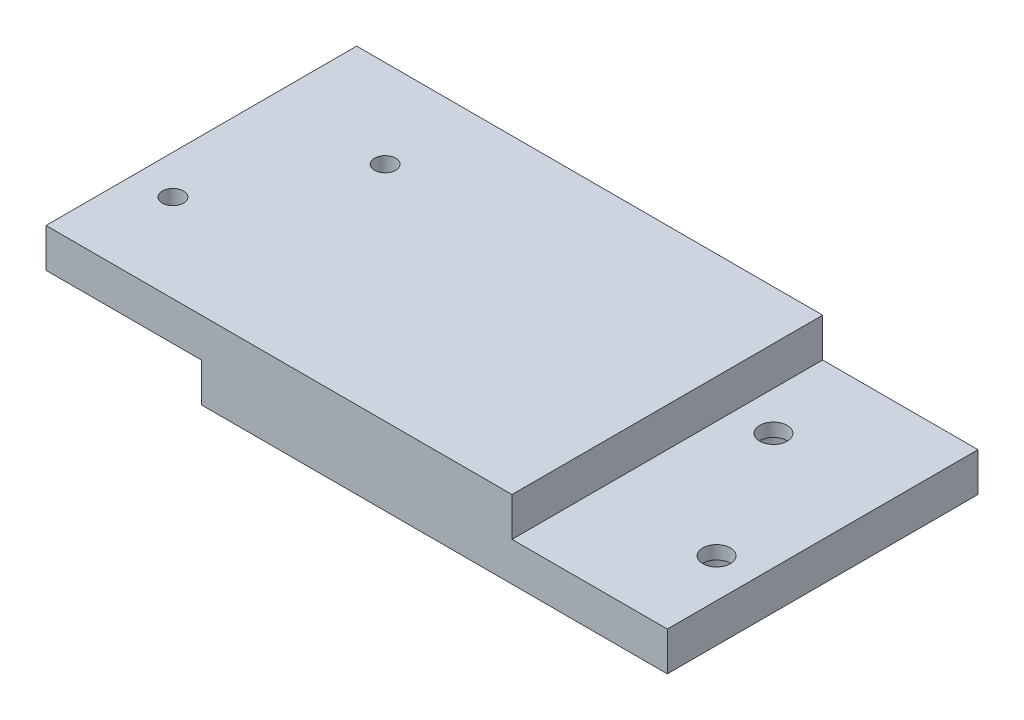
ISO-10303-21;
HEADER;
FILE_DESCRIPTION(('STEP AP214'),'2;1');
FILE_NAME('part.step','',(''),(''),'','','');
FILE_SCHEMA(('AUTOMOTIVE_DESIGN { 1 0 10303 214 1 1 1 1 }'));
ENDSEC;
DATA;
#1=APPLICATION_CONTEXT('core data for automotive mechanical design processes');
#2=APPLICATION_PROTOCOL_DEFINITION('international standard','automotive_design',2000,#1);
#3=PRODUCT_CONTEXT('',#1,'mechanical');
#4=PRODUCT('Part','Part','',(#3));
#5=PRODUCT_RELATED_PRODUCT_CATEGORY('part','',(#4));
#6=PRODUCT_DEFINITION_FORMATION('','',#4);
#7=PRODUCT_DEFINITION_CONTEXT('part definition',#1,'design');
#8=PRODUCT_DEFINITION('design','',#6,#7);
#9=PRODUCT_DEFINITION_SHAPE('','',#8);
#10=(LENGTH_UNIT() NAMED_UNIT(*) SI_UNIT(.MILLI.,.METRE.));
#11=(NAMED_UNIT(*) PLANE_ANGLE_UNIT() SI_UNIT($,.RADIAN.));
#12=(NAMED_UNIT(*) SI_UNIT($,.STERADIAN.) SOLID_ANGLE_UNIT());
#13=UNCERTAINTY_MEASURE_WITH_UNIT(LENGTH_MEASURE(1.E-05),#10,'distance_accuracy_value','');
#14=(GEOMETRIC_REPRESENTATION_CONTEXT(3) GLOBAL_UNCERTAINTY_ASSIGNED_CONTEXT((#13)) GLOBAL_UNIT_ASSIGNED_CONTEXT((#10,
#11,#12)) REPRESENTATION_CONTEXT('',''));
#15=CARTESIAN_POINT('',(0.,0.,0.));
#16=DIRECTION('',(0.,0.,1.));
#17=DIRECTION('',(1.,0.,0.));
#18=AXIS2_PLACEMENT_3D('',#15,#16,#17);
#19=CARTESIAN_POINT('',(76.2,0.,50.8));
#20=DIRECTION('',(1.,0.,0.));
#21=DIRECTION('',(0.,0.,-1.));
#22=AXIS2_PLACEMENT_3D('',#19,#20,#21);
#23=PLANE('',#22);
#24=DIRECTION('',(0.,-1.,0.));
#25=VECTOR('',#24,1.);
#26=CARTESIAN_POINT('',(76.2,0.,0.));
#27=LINE('',#26,#25);
#28=CARTESIAN_POINT('',(76.2,12.7,0.));
#29=VERTEX_POINT('',#28);
#30=CARTESIAN_POINT('',(76.2,6.35,0.));
#31=VERTEX_POINT('',#30);
#32=EDGE_CURVE('E141',#29,#31,#27,.T.);
#33=ORIENTED_EDGE('',*,*,#32,.F.);
#34=DIRECTION('',(0.,0.,-1.));
#35=VECTOR('',#34,1.);
#36=CARTESIAN_POINT('',(76.2,12.7,50.8));
#37=LINE('',#36,#35);
#38=CARTESIAN_POINT('',(76.2,12.7,50.8));
#39=VERTEX_POINT('',#38);
#40=EDGE_CURVE('E11',#39,#29,#37,.T.);
#41=ORIENTED_EDGE('',*,*,#40,.F.);
#42=DIRECTION('',(0.,-1.,0.));
#43=VECTOR('',#42,1.);
#44=CARTESIAN_POINT('',(76.2,0.,50.8));
#45=LINE('',#44,#43);
#46=CARTESIAN_POINT('',(76.2,6.35,50.8));
#47=VERTEX_POINT('',#46);
#48=EDGE_CURVE('E169',#39,#47,#45,.T.);
#49=ORIENTED_EDGE('',*,*,#48,.T.);
#50=DIRECTION('',(0.,0.,-1.));
#51=VECTOR('',#50,1.);
#52=CARTESIAN_POINT('',(76.2,6.35,50.8));
#53=LINE('',#52,#51);
#54=EDGE_CURVE('E96',#47,#31,#53,.T.);
#55=ORIENTED_EDGE('',*,*,#54,.T.);
#56=EDGE_LOOP('',(#33,#41,#49,#55));
#57=FACE_BOUND('',#56,.T.);
#58=ADVANCED_FACE('F42',(#57),#23,.T.);
#59=CARTESIAN_POINT('',(0.,12.7,50.8));
#60=DIRECTION('',(0.,1.,0.));
#61=DIRECTION('',(-1.,0.,0.));
#62=AXIS2_PLACEMENT_3D('',#59,#60,#61);
#63=PLANE('',#62);
#64=CARTESIAN_POINT('',(6.35,12.7,36.3985226280624));
#65=DIRECTION('',(0.,1.,0.));
#66=DIRECTION('',(0.,0.,1.));
#67=AXIS2_PLACEMENT_3D('',#64,#65,#66);
#68=CIRCLE('',#67,1.72719999999999);
#69=CARTESIAN_POINT('',(6.35,12.7,38.1257226280624));
#70=VERTEX_POINT('',#69);
#71=EDGE_CURVE('E191',#70,#70,#68,.T.);
#72=ORIENTED_EDGE('',*,*,#71,.F.);
#73=EDGE_LOOP('',(#72));
#74=FACE_BOUND('',#73,.T.);
#75=CARTESIAN_POINT('',(19.05,12.7,14.4014773719376));
#76=DIRECTION('',(0.,1.,0.));
#77=DIRECTION('',(0.,0.,1.));
#78=AXIS2_PLACEMENT_3D('',#75,#76,#77);
#79=CIRCLE('',#78,1.72719999999999);
#80=CARTESIAN_POINT('',(19.05,12.7,16.1286773719376));
#81=VERTEX_POINT('',#80);
#82=EDGE_CURVE('E187',#81,#81,#79,.T.);
#83=ORIENTED_EDGE('',*,*,#82,.F.);
#84=EDGE_LOOP('',(#83));
#85=FACE_BOUND('',#84,.T.);
#86=DIRECTION('',(1.,0.,0.));
#87=VECTOR('',#86,1.);
#88=CARTESIAN_POINT('',(0.,12.7,0.));
#89=LINE('',#88,#87);
#90=CARTESIAN_POINT('',(0.,12.7,0.));
#91=VERTEX_POINT('',#90);
#92=EDGE_CURVE('E145',#91,#29,#89,.T.);
#93=ORIENTED_EDGE('',*,*,#92,.F.);
#94=DIRECTION('',(0.,0.,-1.));
#95=VECTOR('',#94,1.);
#96=CARTESIAN_POINT('',(0.,12.7,50.8));
#97=LINE('',#96,#95);
#98=CARTESIAN_POINT('',(0.,12.7,50.8));
#99=VERTEX_POINT('',#98);
#100=EDGE_CURVE('E52',#99,#91,#97,.T.);
#101=ORIENTED_EDGE('',*,*,#100,.F.);
#102=DIRECTION('',(1.,0.,0.));
#103=VECTOR('',#102,1.);
#104=CARTESIAN_POINT('',(0.,12.7,50.8));
#105=LINE('',#104,#103);
#106=EDGE_CURVE('E220',#99,#39,#105,.T.);
#107=ORIENTED_EDGE('',*,*,#106,.T.);
#108=ORIENTED_EDGE('',*,*,#40,.T.);
#109=EDGE_LOOP('',(#93,#101,#107,#108));
#110=FACE_BOUND('',#109,.T.);
#111=ADVANCED_FACE('F246',(#74,#85,#110),#63,.T.);
#112=CARTESIAN_POINT('',(0.,0.,50.8));
#113=DIRECTION('',(-1.,0.,0.));
#114=DIRECTION('',(0.,0.,1.));
#115=AXIS2_PLACEMENT_3D('',#112,#113,#114);
#116=PLANE('',#115);
#117=DIRECTION('',(0.,1.,0.));
#118=VECTOR('',#117,1.);
#119=CARTESIAN_POINT('',(0.,0.,0.));
#120=LINE('',#119,#118);
#121=CARTESIAN_POINT('',(0.,6.35,0.));
#122=VERTEX_POINT('',#121);
#123=EDGE_CURVE('E150',#122,#91,#120,.T.);
#124=ORIENTED_EDGE('',*,*,#123,.F.);
#125=DIRECTION('',(0.,0.,-1.));
#126=VECTOR('',#125,1.);
#127=CARTESIAN_POINT('',(0.,6.35,50.8));
#128=LINE('',#127,#126);
#129=CARTESIAN_POINT('',(0.,6.35,50.8));
#130=VERTEX_POINT('',#129);
#131=EDGE_CURVE('E179',#130,#122,#128,.T.);
#132=ORIENTED_EDGE('',*,*,#131,.F.);
#133=DIRECTION('',(0.,1.,0.));
#134=VECTOR('',#133,1.);
#135=CARTESIAN_POINT('',(0.,0.,50.8));
#136=LINE('',#135,#134);
#137=EDGE_CURVE('E224',#130,#99,#136,.T.);
#138=ORIENTED_EDGE('',*,*,#137,.T.);
#139=ORIENTED_EDGE('',*,*,#100,.T.);
#140=EDGE_LOOP('',(#124,#132,#138,#139));
#141=FACE_BOUND('',#140,.T.);
#142=ADVANCED_FACE('F249',(#141),#116,.T.);
#143=CARTESIAN_POINT('',(0.,6.35,50.8));
#144=DIRECTION('',(0.,1.,0.));
#145=DIRECTION('',(0.,0.,1.));
#146=AXIS2_PLACEMENT_3D('',#143,#144,#145);
#147=PLANE('',#146);
#148=CARTESIAN_POINT('',(6.35,6.35,36.3985226280624));
#149=DIRECTION('',(0.,1.,0.));
#150=DIRECTION('',(0.,0.,1.));
#151=AXIS2_PLACEMENT_3D('',#148,#149,#150);
#152=CIRCLE('',#151,1.72719999999999);
#153=CARTESIAN_POINT('',(6.35,6.35,38.1257226280624));
#154=VERTEX_POINT('',#153);
#155=EDGE_CURVE('E188',#154,#154,#152,.T.);
#156=ORIENTED_EDGE('',*,*,#155,.T.);
#157=EDGE_LOOP('',(#156));
#158=FACE_BOUND('',#157,.T.);
#159=CARTESIAN_POINT('',(19.05,6.35,14.4014773719376));
#160=DIRECTION('',(0.,1.,0.));
#161=DIRECTION('',(0.,0.,1.));
#162=AXIS2_PLACEMENT_3D('',#159,#160,#161);
#163=CIRCLE('',#162,1.72719999999999);
#164=CARTESIAN_POINT('',(19.05,6.35,16.1286773719376));
#165=VERTEX_POINT('',#164);
#166=EDGE_CURVE('E146',#165,#165,#163,.T.);
#167=ORIENTED_EDGE('',*,*,#166,.T.);
#168=EDGE_LOOP('',(#167));
#169=FACE_BOUND('',#168,.T.);
#170=DIRECTION('',(1.,0.,0.));
#171=VECTOR('',#170,1.);
#172=CARTESIAN_POINT('',(0.,6.35,0.));
#173=LINE('',#172,#171);
#174=CARTESIAN_POINT('',(25.4,6.35,0.));
#175=VERTEX_POINT('',#174);
#176=EDGE_CURVE('E154',#122,#175,#173,.T.);
#177=ORIENTED_EDGE('',*,*,#176,.T.);
#178=DIRECTION('',(0.,0.,-1.));
#179=VECTOR('',#178,1.);
#180=CARTESIAN_POINT('',(25.4,6.35,50.8));
#181=LINE('',#180,#179);
#182=CARTESIAN_POINT('',(25.4,6.35,50.8));
#183=VERTEX_POINT('',#182);
#184=EDGE_CURVE('E176',#183,#175,#181,.T.);
#185=ORIENTED_EDGE('',*,*,#184,.F.);
#186=DIRECTION('',(1.,0.,0.));
#187=VECTOR('',#186,1.);
#188=CARTESIAN_POINT('',(0.,6.35,50.8));
#189=LINE('',#188,#187);
#190=EDGE_CURVE('E228',#130,#183,#189,.T.);
#191=ORIENTED_EDGE('',*,*,#190,.F.);
#192=ORIENTED_EDGE('',*,*,#131,.T.);
#193=EDGE_LOOP('',(#177,#185,#191,#192));
#194=FACE_BOUND('',#193,.T.);
#195=ADVANCED_FACE('F252',(#158,#169,#194),#147,.F.);
#196=CARTESIAN_POINT('',(25.4,0.,50.8));
#197=DIRECTION('',(-1.,0.,0.));
#198=DIRECTION('',(0.,0.,1.));
#199=AXIS2_PLACEMENT_3D('',#196,#197,#198);
#200=PLANE('',#199);
#201=DIRECTION('',(0.,1.,0.));
#202=VECTOR('',#201,1.);
#203=CARTESIAN_POINT('',(25.4,0.,0.));
#204=LINE('',#203,#202);
#205=CARTESIAN_POINT('',(25.4,0.,0.));
#206=VERTEX_POINT('',#205);
#207=EDGE_CURVE('E158',#206,#175,#204,.T.);
#208=ORIENTED_EDGE('',*,*,#207,.F.);
#209=DIRECTION('',(0.,0.,-1.));
#210=VECTOR('',#209,1.);
#211=CARTESIAN_POINT('',(25.4,0.,50.8));
#212=LINE('',#211,#210);
#213=CARTESIAN_POINT('',(25.4,0.,50.8));
#214=VERTEX_POINT('',#213);
#215=EDGE_CURVE('E130',#214,#206,#212,.T.);
#216=ORIENTED_EDGE('',*,*,#215,.F.);
#217=DIRECTION('',(0.,1.,0.));
#218=VECTOR('',#217,1.);
#219=CARTESIAN_POINT('',(25.4,0.,50.8));
#220=LINE('',#219,#218);
#221=EDGE_CURVE('E121',#214,#183,#220,.T.);
#222=ORIENTED_EDGE('',*,*,#221,.T.);
#223=ORIENTED_EDGE('',*,*,#184,.T.);
#224=EDGE_LOOP('',(#208,#216,#222,#223));
#225=FACE_BOUND('',#224,.T.);
#226=ADVANCED_FACE('F234',(#225),#200,.T.);
#227=CARTESIAN_POINT('',(0.,0.,50.8));
#228=DIRECTION('',(0.,1.,0.));
#229=DIRECTION('',(0.,0.,1.));
#230=AXIS2_PLACEMENT_3D('',#227,#228,#229);
#231=PLANE('',#230);
#232=CARTESIAN_POINT('',(95.25,0.,36.3985226280624));
#233=DIRECTION('',(0.,-1.,0.));
#234=DIRECTION('',(0.,0.,-1.));
#235=AXIS2_PLACEMENT_3D('',#232,#233,#234);
#236=CIRCLE('',#235,3.96875000000001);
#237=CARTESIAN_POINT('',(95.25,0.,32.4297726280624));
#238=VERTEX_POINT('',#237);
#239=EDGE_CURVE('E304',#238,#238,#236,.T.);
#240=ORIENTED_EDGE('',*,*,#239,.F.);
#241=EDGE_LOOP('',(#240));
#242=FACE_BOUND('',#241,.T.);
#243=CARTESIAN_POINT('',(82.55,0.,14.4014773719376));
#244=DIRECTION('',(0.,-1.,0.));
#245=DIRECTION('',(0.,0.,-1.));
#246=AXIS2_PLACEMENT_3D('',#243,#244,#245);
#247=CIRCLE('',#246,3.96875000000001);
#248=CARTESIAN_POINT('',(82.55,0.,10.4327273719376));
#249=VERTEX_POINT('',#248);
#250=EDGE_CURVE('E211',#249,#249,#247,.T.);
#251=ORIENTED_EDGE('',*,*,#250,.F.);
#252=EDGE_LOOP('',(#251));
#253=FACE_BOUND('',#252,.T.);
#254=DIRECTION('',(1.,0.,0.));
#255=VECTOR('',#254,1.);
#256=CARTESIAN_POINT('',(0.,0.,0.));
#257=LINE('',#256,#255);
#258=CARTESIAN_POINT('',(101.6,0.,0.));
#259=VERTEX_POINT('',#258);
#260=EDGE_CURVE('E128',#206,#259,#257,.T.);
#261=ORIENTED_EDGE('',*,*,#260,.T.);
#262=DIRECTION('',(0.,0.,-1.));
#263=VECTOR('',#262,1.);
#264=CARTESIAN_POINT('',(101.6,0.,50.8));
#265=LINE('',#264,#263);
#266=CARTESIAN_POINT('',(101.6,0.,50.8));
#267=VERTEX_POINT('',#266);
#268=EDGE_CURVE('E125',#267,#259,#265,.T.);
#269=ORIENTED_EDGE('',*,*,#268,.F.);
#270=DIRECTION('',(1.,0.,0.));
#271=VECTOR('',#270,1.);
#272=CARTESIAN_POINT('',(0.,0.,50.8));
#273=LINE('',#272,#271);
#274=EDGE_CURVE('E115',#214,#267,#273,.T.);
#275=ORIENTED_EDGE('',*,*,#274,.F.);
#276=ORIENTED_EDGE('',*,*,#215,.T.);
#277=EDGE_LOOP('',(#261,#269,#275,#276));
#278=FACE_BOUND('',#277,.T.);
#279=ADVANCED_FACE('F126',(#242,#253,#278),#231,.F.);
#280=CARTESIAN_POINT('',(101.6,0.,50.8));
#281=DIRECTION('',(-1.,0.,0.));
#282=DIRECTION('',(0.,0.,1.));
#283=AXIS2_PLACEMENT_3D('',#280,#281,#282);
#284=PLANE('',#283);
#285=DIRECTION('',(0.,1.,0.));
#286=VECTOR('',#285,1.);
#287=CARTESIAN_POINT('',(101.6,0.,0.));
#288=LINE('',#287,#286);
#289=CARTESIAN_POINT('',(101.6,6.35,0.));
#290=VERTEX_POINT('',#289);
#291=EDGE_CURVE('E89',#259,#290,#288,.T.);
#292=ORIENTED_EDGE('',*,*,#291,.T.);
#293=DIRECTION('',(0.,0.,-1.));
#294=VECTOR('',#293,1.);
#295=CARTESIAN_POINT('',(101.6,6.35,50.8));
#296=LINE('',#295,#294);
#297=CARTESIAN_POINT('',(101.6,6.35,50.8));
#298=VERTEX_POINT('',#297);
#299=EDGE_CURVE('E131',#298,#290,#296,.T.);
#300=ORIENTED_EDGE('',*,*,#299,.F.);
#301=DIRECTION('',(0.,1.,0.));
#302=VECTOR('',#301,1.);
#303=CARTESIAN_POINT('',(101.6,0.,50.8));
#304=LINE('',#303,#302);
#305=EDGE_CURVE('E119',#267,#298,#304,.T.);
#306=ORIENTED_EDGE('',*,*,#305,.F.);
#307=ORIENTED_EDGE('',*,*,#268,.T.);
#308=EDGE_LOOP('',(#292,#300,#306,#307));
#309=FACE_BOUND('',#308,.T.);
#310=ADVANCED_FACE('F133',(#309),#284,.F.);
#311=CARTESIAN_POINT('',(0.,6.34999999999997,50.8));
#312=DIRECTION('',(0.,-1.,0.));
#313=DIRECTION('',(1.,0.,0.));
#314=AXIS2_PLACEMENT_3D('',#311,#312,#313);
#315=PLANE('',#314);
#316=CARTESIAN_POINT('',(95.25,6.35,36.3985226280624));
#317=DIRECTION('',(0.,-1.,0.));
#318=DIRECTION('',(1.,0.,0.));
#319=AXIS2_PLACEMENT_3D('',#316,#317,#318);
#320=CIRCLE('',#319,2.2479);
#321=CARTESIAN_POINT('',(97.4979,6.35,36.3985226280624));
#322=VERTEX_POINT('',#321);
#323=EDGE_CURVE('E45',#322,#322,#320,.T.);
#324=ORIENTED_EDGE('',*,*,#323,.T.);
#325=EDGE_LOOP('',(#324));
#326=FACE_BOUND('',#325,.T.);
#327=CARTESIAN_POINT('',(82.55,6.35,14.4014773719376));
#328=DIRECTION('',(0.,-1.,0.));
#329=DIRECTION('',(1.,0.,0.));
#330=AXIS2_PLACEMENT_3D('',#327,#328,#329);
#331=CIRCLE('',#330,2.2479);
#332=CARTESIAN_POINT('',(84.7979,6.35,14.4014773719376));
#333=VERTEX_POINT('',#332);
#334=EDGE_CURVE('E192',#333,#333,#331,.T.);
#335=ORIENTED_EDGE('',*,*,#334,.T.);
#336=EDGE_LOOP('',(#335));
#337=FACE_BOUND('',#336,.T.);
#338=DIRECTION('',(-1.,0.,0.));
#339=VECTOR('',#338,1.);
#340=CARTESIAN_POINT('',(0.,6.34999999999997,0.));
#341=LINE('',#340,#339);
#342=EDGE_CURVE('E166',#290,#31,#341,.T.);
#343=ORIENTED_EDGE('',*,*,#342,.T.);
#344=ORIENTED_EDGE('',*,*,#54,.F.);
#345=DIRECTION('',(-1.,0.,0.));
#346=VECTOR('',#345,1.);
#347=CARTESIAN_POINT('',(0.,6.34999999999997,50.8));
#348=LINE('',#347,#346);
#349=EDGE_CURVE('E61',#298,#47,#348,.T.);
#350=ORIENTED_EDGE('',*,*,#349,.F.);
#351=ORIENTED_EDGE('',*,*,#299,.T.);
#352=EDGE_LOOP('',(#343,#344,#350,#351));
#353=FACE_BOUND('',#352,.T.);
#354=ADVANCED_FACE('F241',(#326,#337,#353),#315,.F.);
#355=CARTESIAN_POINT('',(0.,0.,50.8));
#356=DIRECTION('',(0.,0.,1.));
#357=DIRECTION('',(1.,0.,0.));
#358=AXIS2_PLACEMENT_3D('',#355,#356,#357);
#359=PLANE('',#358);
#360=ORIENTED_EDGE('',*,*,#48,.F.);
#361=ORIENTED_EDGE('',*,*,#106,.F.);
#362=ORIENTED_EDGE('',*,*,#137,.F.);
#363=ORIENTED_EDGE('',*,*,#190,.T.);
#364=ORIENTED_EDGE('',*,*,#221,.F.);
#365=ORIENTED_EDGE('',*,*,#274,.T.);
#366=ORIENTED_EDGE('',*,*,#305,.T.);
#367=ORIENTED_EDGE('',*,*,#349,.T.);
#368=EDGE_LOOP('',(#360,#361,#362,#363,#364,#365,#366,#367));
#369=FACE_BOUND('',#368,.T.);
#370=ADVANCED_FACE('F117',(#369),#359,.T.);
#371=CARTESIAN_POINT('',(0.,0.,0.));
#372=DIRECTION('',(0.,0.,1.));
#373=DIRECTION('',(1.,0.,0.));
#374=AXIS2_PLACEMENT_3D('',#371,#372,#373);
#375=PLANE('',#374);
#376=ORIENTED_EDGE('',*,*,#32,.T.);
#377=ORIENTED_EDGE('',*,*,#342,.F.);
#378=ORIENTED_EDGE('',*,*,#291,.F.);
#379=ORIENTED_EDGE('',*,*,#260,.F.);
#380=ORIENTED_EDGE('',*,*,#207,.T.);
#381=ORIENTED_EDGE('',*,*,#176,.F.);
#382=ORIENTED_EDGE('',*,*,#123,.T.);
#383=ORIENTED_EDGE('',*,*,#92,.T.);
#384=EDGE_LOOP('',(#376,#377,#378,#379,#380,#381,#382,#383));
#385=FACE_BOUND('',#384,.T.);
#386=ADVANCED_FACE('F237',(#385),#375,.F.);
#387=CARTESIAN_POINT('',(19.05,12.7,14.4014773719376));
#388=DIRECTION('',(0.,1.,0.));
#389=DIRECTION('',(0.,0.,1.));
#390=AXIS2_PLACEMENT_3D('',#387,#388,#389);
#391=CYLINDRICAL_SURFACE('',#390,1.72719999999999);
#392=ORIENTED_EDGE('',*,*,#82,.T.);
#393=EDGE_LOOP('',(#392));
#394=FACE_BOUND('',#393,.T.);
#395=ORIENTED_EDGE('',*,*,#166,.F.);
#396=EDGE_LOOP('',(#395));
#397=FACE_BOUND('',#396,.T.);
#398=ADVANCED_FACE('F274',(#394,#397),#391,.F.);
#399=CARTESIAN_POINT('',(6.35,12.7,36.3985226280624));
#400=DIRECTION('',(0.,1.,0.));
#401=DIRECTION('',(0.,0.,1.));
#402=AXIS2_PLACEMENT_3D('',#399,#400,#401);
#403=CYLINDRICAL_SURFACE('',#402,1.72719999999999);
#404=ORIENTED_EDGE('',*,*,#71,.T.);
#405=EDGE_LOOP('',(#404));
#406=FACE_BOUND('',#405,.T.);
#407=ORIENTED_EDGE('',*,*,#155,.F.);
#408=EDGE_LOOP('',(#407));
#409=FACE_BOUND('',#408,.T.);
#410=ADVANCED_FACE('F277',(#406,#409),#403,.F.);
#411=CARTESIAN_POINT('',(82.55,0.,14.4014773719376));
#412=DIRECTION('',(0.,-1.,0.));
#413=DIRECTION('',(0.,0.,-1.));
#414=AXIS2_PLACEMENT_3D('',#411,#412,#413);
#415=CYLINDRICAL_SURFACE('',#414,2.2479);
#416=CARTESIAN_POINT('',(82.55,4.1656,14.4014773719376));
#417=DIRECTION('',(0.,-1.,0.));
#418=DIRECTION('',(0.,0.,-1.));
#419=AXIS2_PLACEMENT_3D('',#416,#417,#418);
#420=CIRCLE('',#419,2.2479);
#421=CARTESIAN_POINT('',(82.55,4.1656,12.1535773719376));
#422=VERTEX_POINT('',#421);
#423=EDGE_CURVE('E195',#422,#422,#420,.T.);
#424=ORIENTED_EDGE('',*,*,#423,.T.);
#425=EDGE_LOOP('',(#424));
#426=FACE_BOUND('',#425,.T.);
#427=ORIENTED_EDGE('',*,*,#334,.F.);
#428=EDGE_LOOP('',(#427));
#429=FACE_BOUND('',#428,.T.);
#430=ADVANCED_FACE('F284',(#426,#429),#415,.F.);
#431=CARTESIAN_POINT('',(84.7979,4.1656,14.4014773719376));
#432=DIRECTION('',(0.,1.,0.));
#433=DIRECTION('',(0.,0.,1.));
#434=AXIS2_PLACEMENT_3D('',#431,#432,#433);
#435=PLANE('',#434);
#436=ORIENTED_EDGE('',*,*,#423,.F.);
#437=EDGE_LOOP('',(#436));
#438=FACE_BOUND('',#437,.T.);
#439=CARTESIAN_POINT('',(82.55,4.1656,14.4014773719376));
#440=DIRECTION('',(0.,-1.,0.));
#441=DIRECTION('',(0.,0.,-1.));
#442=AXIS2_PLACEMENT_3D('',#439,#440,#441);
#443=CIRCLE('',#442,3.96875000000001);
#444=CARTESIAN_POINT('',(82.55,4.1656,10.4327273719376));
#445=VERTEX_POINT('',#444);
#446=EDGE_CURVE('E204',#445,#445,#443,.T.);
#447=ORIENTED_EDGE('',*,*,#446,.T.);
#448=EDGE_LOOP('',(#447));
#449=FACE_BOUND('',#448,.T.);
#450=ADVANCED_FACE('F343',(#438,#449),#435,.F.);
#451=CARTESIAN_POINT('',(82.55,0.,14.4014773719376));
#452=DIRECTION('',(0.,-1.,0.));
#453=DIRECTION('',(0.,0.,-1.));
#454=AXIS2_PLACEMENT_3D('',#451,#452,#453);
#455=CYLINDRICAL_SURFACE('',#454,3.96875000000001);
#456=ORIENTED_EDGE('',*,*,#446,.F.);
#457=EDGE_LOOP('',(#456));
#458=FACE_BOUND('',#457,.T.);
#459=ORIENTED_EDGE('',*,*,#250,.T.);
#460=EDGE_LOOP('',(#459));
#461=FACE_BOUND('',#460,.T.);
#462=ADVANCED_FACE('F339',(#458,#461),#455,.F.);
#463=CARTESIAN_POINT('',(95.25,0.,36.3985226280624));
#464=DIRECTION('',(0.,-1.,0.));
#465=DIRECTION('',(0.,0.,-1.));
#466=AXIS2_PLACEMENT_3D('',#463,#464,#465);
#467=CYLINDRICAL_SURFACE('',#466,2.2479);
#468=CARTESIAN_POINT('',(95.25,4.1656,36.3985226280624));
#469=DIRECTION('',(0.,-1.,0.));
#470=DIRECTION('',(0.,0.,-1.));
#471=AXIS2_PLACEMENT_3D('',#468,#469,#470);
#472=CIRCLE('',#471,2.2479);
#473=CARTESIAN_POINT('',(95.25,4.1656,34.1506226280624));
#474=VERTEX_POINT('',#473);
#475=EDGE_CURVE('E312',#474,#474,#472,.T.);
#476=ORIENTED_EDGE('',*,*,#475,.T.);
#477=EDGE_LOOP('',(#476));
#478=FACE_BOUND('',#477,.T.);
#479=ORIENTED_EDGE('',*,*,#323,.F.);
#480=EDGE_LOOP('',(#479));
#481=FACE_BOUND('',#480,.T.);
#482=ADVANCED_FACE('F332',(#478,#481),#467,.F.);
#483=CARTESIAN_POINT('',(97.4979,4.1656,36.3985226280624));
#484=DIRECTION('',(0.,1.,0.));
#485=DIRECTION('',(0.,0.,1.));
#486=AXIS2_PLACEMENT_3D('',#483,#484,#485);
#487=PLANE('',#486);
#488=ORIENTED_EDGE('',*,*,#475,.F.);
#489=EDGE_LOOP('',(#488));
#490=FACE_BOUND('',#489,.T.);
#491=CARTESIAN_POINT('',(95.25,4.1656,36.3985226280624));
#492=DIRECTION('',(0.,-1.,0.));
#493=DIRECTION('',(0.,0.,-1.));
#494=AXIS2_PLACEMENT_3D('',#491,#492,#493);
#495=CIRCLE('',#494,3.96875000000001);
#496=CARTESIAN_POINT('',(95.25,4.1656,32.4297726280624));
#497=VERTEX_POINT('',#496);
#498=EDGE_CURVE('E317',#497,#497,#495,.T.);
#499=ORIENTED_EDGE('',*,*,#498,.T.);
#500=EDGE_LOOP('',(#499));
#501=FACE_BOUND('',#500,.T.);
#502=ADVANCED_FACE('F326',(#490,#501),#487,.F.);
#503=CARTESIAN_POINT('',(95.25,0.,36.3985226280624));
#504=DIRECTION('',(0.,-1.,0.));
#505=DIRECTION('',(0.,0.,-1.));
#506=AXIS2_PLACEMENT_3D('',#503,#504,#505);
#507=CYLINDRICAL_SURFACE('',#506,3.96875000000001);
#508=ORIENTED_EDGE('',*,*,#498,.F.);
#509=EDGE_LOOP('',(#508));
#510=FACE_BOUND('',#509,.T.);
#511=ORIENTED_EDGE('',*,*,#239,.T.);
#512=EDGE_LOOP('',(#511));
#513=FACE_BOUND('',#512,.T.);
#514=ADVANCED_FACE('F324',(#510,#513),#507,.F.);
#515=CLOSED_SHELL('',(#58,#111,#142,#195,#226,#279,#310,#354,#370,#386,#398,#410,#430,#450,#462,
#482,#502,#514));
#516=MANIFOLD_SOLID_BREP('B2',#515);
#517=ADVANCED_BREP_SHAPE_REPRESENTATION('',(#18,#516),#14);
#518=SHAPE_DEFINITION_REPRESENTATION(#9,#517);
ENDSEC;
END-ISO-10303-21;
